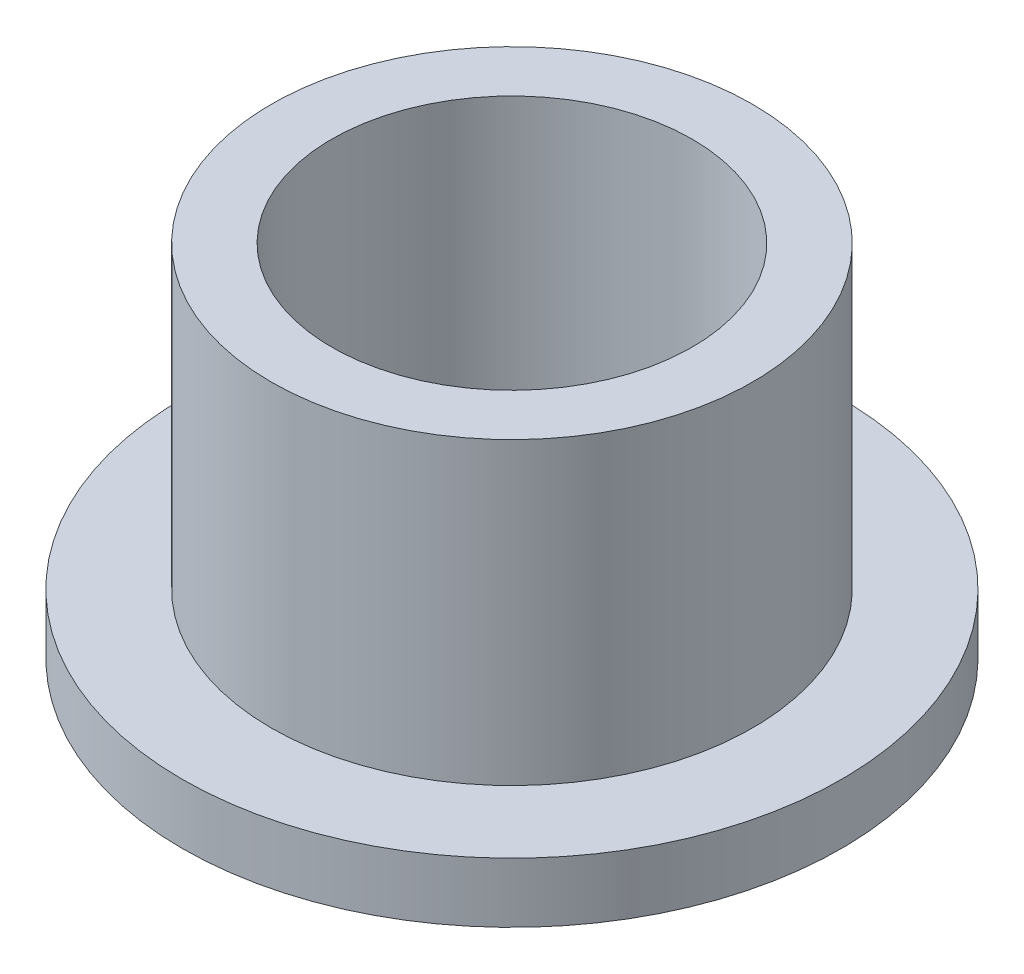
ISO-10303-21;
HEADER;
FILE_DESCRIPTION(('STEP AP214'),'2;1');
FILE_NAME('part.step','',(''),(''),'','','');
FILE_SCHEMA(('AUTOMOTIVE_DESIGN { 1 0 10303 214 1 1 1 1 }'));
ENDSEC;
DATA;
#1=APPLICATION_CONTEXT('core data for automotive mechanical design processes');
#2=APPLICATION_PROTOCOL_DEFINITION('international standard','automotive_design',2000,#1);
#3=PRODUCT_CONTEXT('',#1,'mechanical');
#4=PRODUCT('Part','Part','',(#3));
#5=PRODUCT_RELATED_PRODUCT_CATEGORY('part','',(#4));
#6=PRODUCT_DEFINITION_FORMATION('','',#4);
#7=PRODUCT_DEFINITION_CONTEXT('part definition',#1,'design');
#8=PRODUCT_DEFINITION('design','',#6,#7);
#9=PRODUCT_DEFINITION_SHAPE('','',#8);
#10=(LENGTH_UNIT() NAMED_UNIT(*) SI_UNIT(.MILLI.,.METRE.));
#11=(NAMED_UNIT(*) PLANE_ANGLE_UNIT() SI_UNIT($,.RADIAN.));
#12=(NAMED_UNIT(*) SI_UNIT($,.STERADIAN.) SOLID_ANGLE_UNIT());
#13=UNCERTAINTY_MEASURE_WITH_UNIT(LENGTH_MEASURE(1.E-05),#10,'distance_accuracy_value','');
#14=(GEOMETRIC_REPRESENTATION_CONTEXT(3) GLOBAL_UNCERTAINTY_ASSIGNED_CONTEXT((#13)) GLOBAL_UNIT_ASSIGNED_CONTEXT((#10,
#11,#12)) REPRESENTATION_CONTEXT('',''));
#15=CARTESIAN_POINT('',(0.,0.,0.));
#16=DIRECTION('',(0.,0.,1.));
#17=DIRECTION('',(1.,0.,0.));
#18=AXIS2_PLACEMENT_3D('',#15,#16,#17);
#19=CARTESIAN_POINT('',(0.,9.525,0.));
#20=DIRECTION('',(0.,1.,0.));
#21=DIRECTION('',(0.,0.,1.));
#22=AXIS2_PLACEMENT_3D('',#19,#20,#21);
#23=PLANE('',#22);
#24=CARTESIAN_POINT('',(0.,9.525,0.));
#25=DIRECTION('',(0.,1.,0.));
#26=DIRECTION('',(0.,0.,1.));
#27=AXIS2_PLACEMENT_3D('',#24,#25,#26);
#28=CIRCLE('',#27,6.3754);
#29=CARTESIAN_POINT('',(0.,9.525,-6.3754));
#30=VERTEX_POINT('',#29);
#31=EDGE_CURVE('E12',#30,#30,#28,.T.);
#32=ORIENTED_EDGE('',*,*,#31,.T.);
#33=EDGE_LOOP('',(#32));
#34=FACE_BOUND('',#33,.T.);
#35=CARTESIAN_POINT('',(0.,9.525,0.));
#36=DIRECTION('',(0.,1.,0.));
#37=DIRECTION('',(0.,0.,1.));
#38=AXIS2_PLACEMENT_3D('',#35,#36,#37);
#39=CIRCLE('',#38,4.7752);
#40=CARTESIAN_POINT('',(0.,9.525,-4.7752));
#41=VERTEX_POINT('',#40);
#42=EDGE_CURVE('E57',#41,#41,#39,.T.);
#43=ORIENTED_EDGE('',*,*,#42,.F.);
#44=EDGE_LOOP('',(#43));
#45=FACE_BOUND('',#44,.T.);
#46=ADVANCED_FACE('F49',(#34,#45),#23,.T.);
#47=CARTESIAN_POINT('',(0.,0.,0.));
#48=DIRECTION('',(0.,1.,0.));
#49=DIRECTION('',(0.,0.,1.));
#50=AXIS2_PLACEMENT_3D('',#47,#48,#49);
#51=PLANE('',#50);
#52=CARTESIAN_POINT('',(0.,0.,0.));
#53=DIRECTION('',(0.,1.,0.));
#54=DIRECTION('',(0.,0.,1.));
#55=AXIS2_PLACEMENT_3D('',#52,#53,#54);
#56=CIRCLE('',#55,4.7752);
#57=CARTESIAN_POINT('',(0.,0.,-4.7752));
#58=VERTEX_POINT('',#57);
#59=EDGE_CURVE('E63',#58,#58,#56,.T.);
#60=ORIENTED_EDGE('',*,*,#59,.T.);
#61=EDGE_LOOP('',(#60));
#62=FACE_BOUND('',#61,.T.);
#63=CARTESIAN_POINT('',(0.,0.,0.));
#64=DIRECTION('',(0.,1.,0.));
#65=DIRECTION('',(0.,0.,1.));
#66=AXIS2_PLACEMENT_3D('',#63,#64,#65);
#67=CIRCLE('',#66,8.73125);
#68=CARTESIAN_POINT('',(0.,0.,8.73125));
#69=VERTEX_POINT('',#68);
#70=EDGE_CURVE('E72',#69,#69,#67,.T.);
#71=ORIENTED_EDGE('',*,*,#70,.F.);
#72=EDGE_LOOP('',(#71));
#73=FACE_BOUND('',#72,.T.);
#74=ADVANCED_FACE('F101',(#62,#73),#51,.F.);
#75=CARTESIAN_POINT('',(0.,9.525,0.));
#76=DIRECTION('',(0.,-1.,0.));
#77=DIRECTION('',(0.,0.,-1.));
#78=AXIS2_PLACEMENT_3D('',#75,#76,#77);
#79=CYLINDRICAL_SURFACE('',#78,6.3754);
#80=CARTESIAN_POINT('',(0.,1.5875,0.));
#81=DIRECTION('',(0.,1.,0.));
#82=DIRECTION('',(0.,0.,1.));
#83=AXIS2_PLACEMENT_3D('',#80,#81,#82);
#84=CIRCLE('',#83,6.3754);
#85=CARTESIAN_POINT('',(0.,1.5875,-6.3754));
#86=VERTEX_POINT('',#85);
#87=EDGE_CURVE('E76',#86,#86,#84,.T.);
#88=CARTESIAN_POINT('',(0.,1.5875,-6.3754));
#89=CARTESIAN_POINT('',(0.,1.67018229166667,-6.3754));
#90=CARTESIAN_POINT('',(0.,1.75286458333333,-6.3754));
#91=CARTESIAN_POINT('',(0.,1.91822916666666,-6.3754));
#92=CARTESIAN_POINT('',(0.,2.00091145833333,-6.3754));
#93=CARTESIAN_POINT('',(0.,2.16627604166666,-6.3754));
#94=CARTESIAN_POINT('',(0.,2.24895833333333,-6.3754));
#95=CARTESIAN_POINT('',(0.,2.41432291666667,-6.3754));
#96=CARTESIAN_POINT('',(0.,2.49700520833333,-6.3754));
#97=CARTESIAN_POINT('',(0.,2.66236979166666,-6.3754));
#98=CARTESIAN_POINT('',(0.,2.74505208333333,-6.3754));
#99=CARTESIAN_POINT('',(0.,2.91041666666667,-6.3754));
#100=CARTESIAN_POINT('',(0.,2.99309895833333,-6.3754));
#101=CARTESIAN_POINT('',(0.,3.15846354166667,-6.3754));
#102=CARTESIAN_POINT('',(0.,3.24114583333333,-6.3754));
#103=CARTESIAN_POINT('',(0.,3.40651041666667,-6.3754));
#104=CARTESIAN_POINT('',(0.,3.48919270833333,-6.3754));
#105=CARTESIAN_POINT('',(0.,3.65455729166667,-6.3754));
#106=CARTESIAN_POINT('',(0.,3.73723958333333,-6.3754));
#107=CARTESIAN_POINT('',(0.,3.90260416666667,-6.3754));
#108=CARTESIAN_POINT('',(0.,3.98528645833333,-6.3754));
#109=CARTESIAN_POINT('',(0.,4.15065104166667,-6.3754));
#110=CARTESIAN_POINT('',(0.,4.23333333333333,-6.3754));
#111=CARTESIAN_POINT('',(0.,4.39869791666667,-6.3754));
#112=CARTESIAN_POINT('',(0.,4.48138020833333,-6.3754));
#113=CARTESIAN_POINT('',(0.,4.64674479166667,-6.3754));
#114=CARTESIAN_POINT('',(0.,4.72942708333333,-6.3754));
#115=CARTESIAN_POINT('',(0.,4.89479166666667,-6.3754));
#116=CARTESIAN_POINT('',(0.,4.97747395833333,-6.3754));
#117=CARTESIAN_POINT('',(0.,5.14283854166667,-6.3754));
#118=CARTESIAN_POINT('',(0.,5.22552083333333,-6.3754));
#119=CARTESIAN_POINT('',(0.,5.39088541666667,-6.3754));
#120=CARTESIAN_POINT('',(0.,5.47356770833333,-6.3754));
#121=CARTESIAN_POINT('',(0.,5.63893229166667,-6.3754));
#122=CARTESIAN_POINT('',(0.,5.72161458333333,-6.3754));
#123=CARTESIAN_POINT('',(0.,5.88697916666667,-6.3754));
#124=CARTESIAN_POINT('',(0.,5.96966145833333,-6.3754));
#125=CARTESIAN_POINT('',(0.,6.13502604166667,-6.3754));
#126=CARTESIAN_POINT('',(0.,6.21770833333333,-6.3754));
#127=CARTESIAN_POINT('',(0.,6.38307291666667,-6.3754));
#128=CARTESIAN_POINT('',(0.,6.46575520833333,-6.3754));
#129=CARTESIAN_POINT('',(0.,6.63111979166667,-6.3754));
#130=CARTESIAN_POINT('',(0.,6.71380208333333,-6.3754));
#131=CARTESIAN_POINT('',(0.,6.87916666666667,-6.3754));
#132=CARTESIAN_POINT('',(0.,6.96184895833333,-6.3754));
#133=CARTESIAN_POINT('',(0.,7.12721354166667,-6.3754));
#134=CARTESIAN_POINT('',(0.,7.20989583333333,-6.3754));
#135=CARTESIAN_POINT('',(0.,7.37526041666667,-6.3754));
#136=CARTESIAN_POINT('',(0.,7.45794270833333,-6.3754));
#137=CARTESIAN_POINT('',(0.,7.62330729166667,-6.3754));
#138=CARTESIAN_POINT('',(0.,7.70598958333333,-6.3754));
#139=CARTESIAN_POINT('',(0.,7.87135416666667,-6.3754));
#140=CARTESIAN_POINT('',(0.,7.95403645833333,-6.3754));
#141=CARTESIAN_POINT('',(0.,8.11940104166667,-6.3754));
#142=CARTESIAN_POINT('',(0.,8.20208333333333,-6.3754));
#143=CARTESIAN_POINT('',(0.,8.36744791666667,-6.3754));
#144=CARTESIAN_POINT('',(0.,8.45013020833333,-6.3754));
#145=CARTESIAN_POINT('',(0.,8.61549479166667,-6.3754));
#146=CARTESIAN_POINT('',(0.,8.69817708333333,-6.3754));
#147=CARTESIAN_POINT('',(0.,8.86354166666667,-6.3754));
#148=CARTESIAN_POINT('',(0.,8.94622395833333,-6.3754));
#149=CARTESIAN_POINT('',(0.,9.11158854166667,-6.3754));
#150=CARTESIAN_POINT('',(0.,9.19427083333333,-6.3754));
#151=CARTESIAN_POINT('',(0.,9.35963541666667,-6.3754));
#152=CARTESIAN_POINT('',(0.,9.44231770833333,-6.3754));
#153=CARTESIAN_POINT('',(0.,9.525,-6.3754));
#154=B_SPLINE_CURVE_WITH_KNOTS('',3,(#88,#89,#90,#91,#92,#93,#94,#95,#96,#97,#98,#99,#100,#101,
#102,#103,#104,#105,#106,#107,#108,#109,#110,#111,#112,#113,#114,#115,#116,#117,#118,#119,#120,
#121,#122,#123,#124,#125,#126,#127,#128,#129,#130,#131,#132,#133,#134,#135,#136,#137,#138,#139,
#140,#141,#142,#143,#144,#145,#146,#147,#148,#149,#150,#151,#152,#153),.UNSPECIFIED.,.F.,.F.,(4,
2,2,2,2,2,2,2,2,2,2,2,2,2,2,2,2,2,2,2,2,2,2,2,2,2,2,2,2,2,2,2,4),(0.,0.248046875,
0.496093749999999,0.744140625,0.992187499999999,1.240234375,1.48828125,1.736328125,1.984375,
2.232421875,2.48046875,2.728515625,2.9765625,3.224609375,3.47265625,3.720703125,3.96875,
4.216796875,4.46484375,4.712890625,4.9609375,5.208984375,5.45703125,5.705078125,5.953125,
6.201171875,6.44921875,6.697265625,6.9453125,7.193359375,7.44140625,7.689453125,7.9375),.UNSPECIFIED.);
#155=EDGE_CURVE('BSEAM51',#86,#30,#154,.T.);
#156=ORIENTED_EDGE('',*,*,#87,.T.);
#157=ORIENTED_EDGE('',*,*,#31,.F.);
#158=ORIENTED_EDGE('',*,*,#155,.T.);
#159=ORIENTED_EDGE('',*,*,#155,.F.);
#160=EDGE_LOOP('',(#156,#158,#157,#159));
#161=FACE_BOUND('',#160,.T.);
#162=ADVANCED_FACE('F51',(#161),#79,.T.);
#163=CARTESIAN_POINT('',(0.,9.525,0.));
#164=DIRECTION('',(0.,-1.,0.));
#165=DIRECTION('',(0.,0.,-1.));
#166=AXIS2_PLACEMENT_3D('',#163,#164,#165);
#167=CYLINDRICAL_SURFACE('',#166,4.7752);
#168=CARTESIAN_POINT('',(0.,9.525,-4.7752));
#169=CARTESIAN_POINT('',(0.,9.42578125,-4.7752));
#170=CARTESIAN_POINT('',(0.,9.3265625,-4.7752));
#171=CARTESIAN_POINT('',(0.,9.128125,-4.7752));
#172=CARTESIAN_POINT('',(0.,9.02890625,-4.7752));
#173=CARTESIAN_POINT('',(0.,8.83046875,-4.7752));
#174=CARTESIAN_POINT('',(0.,8.73125,-4.7752));
#175=CARTESIAN_POINT('',(0.,8.5328125,-4.7752));
#176=CARTESIAN_POINT('',(0.,8.43359375,-4.7752));
#177=CARTESIAN_POINT('',(0.,8.23515625,-4.7752));
#178=CARTESIAN_POINT('',(0.,8.1359375,-4.7752));
#179=CARTESIAN_POINT('',(0.,7.9375,-4.7752));
#180=CARTESIAN_POINT('',(0.,7.83828125,-4.7752));
#181=CARTESIAN_POINT('',(0.,7.63984375,-4.7752));
#182=CARTESIAN_POINT('',(0.,7.540625,-4.7752));
#183=CARTESIAN_POINT('',(0.,7.3421875,-4.7752));
#184=CARTESIAN_POINT('',(0.,7.24296875,-4.7752));
#185=CARTESIAN_POINT('',(0.,7.04453125,-4.7752));
#186=CARTESIAN_POINT('',(0.,6.9453125,-4.7752));
#187=CARTESIAN_POINT('',(0.,6.746875,-4.7752));
#188=CARTESIAN_POINT('',(0.,6.64765625,-4.7752));
#189=CARTESIAN_POINT('',(0.,6.44921875,-4.7752));
#190=CARTESIAN_POINT('',(0.,6.35,-4.7752));
#191=CARTESIAN_POINT('',(0.,6.1515625,-4.7752));
#192=CARTESIAN_POINT('',(0.,6.05234375,-4.7752));
#193=CARTESIAN_POINT('',(0.,5.85390625,-4.7752));
#194=CARTESIAN_POINT('',(0.,5.7546875,-4.7752));
#195=CARTESIAN_POINT('',(0.,5.55625,-4.7752));
#196=CARTESIAN_POINT('',(0.,5.45703125,-4.7752));
#197=CARTESIAN_POINT('',(0.,5.25859375,-4.7752));
#198=CARTESIAN_POINT('',(0.,5.159375,-4.7752));
#199=CARTESIAN_POINT('',(0.,4.9609375,-4.7752));
#200=CARTESIAN_POINT('',(0.,4.86171875,-4.7752));
#201=CARTESIAN_POINT('',(0.,4.66328125,-4.7752));
#202=CARTESIAN_POINT('',(0.,4.5640625,-4.7752));
#203=CARTESIAN_POINT('',(0.,4.365625,-4.7752));
#204=CARTESIAN_POINT('',(0.,4.26640625,-4.7752));
#205=CARTESIAN_POINT('',(0.,4.06796875,-4.7752));
#206=CARTESIAN_POINT('',(0.,3.96875,-4.7752));
#207=CARTESIAN_POINT('',(0.,3.7703125,-4.7752));
#208=CARTESIAN_POINT('',(0.,3.67109375,-4.7752));
#209=CARTESIAN_POINT('',(0.,3.47265625,-4.7752));
#210=CARTESIAN_POINT('',(0.,3.3734375,-4.7752));
#211=CARTESIAN_POINT('',(0.,3.175,-4.7752));
#212=CARTESIAN_POINT('',(0.,3.07578125,-4.7752));
#213=CARTESIAN_POINT('',(0.,2.87734375,-4.7752));
#214=CARTESIAN_POINT('',(0.,2.778125,-4.7752));
#215=CARTESIAN_POINT('',(0.,2.5796875,-4.7752));
#216=CARTESIAN_POINT('',(0.,2.48046875,-4.7752));
#217=CARTESIAN_POINT('',(0.,2.28203125,-4.7752));
#218=CARTESIAN_POINT('',(0.,2.1828125,-4.7752));
#219=CARTESIAN_POINT('',(0.,1.984375,-4.7752));
#220=CARTESIAN_POINT('',(0.,1.88515625,-4.7752));
#221=CARTESIAN_POINT('',(0.,1.68671875,-4.7752));
#222=CARTESIAN_POINT('',(0.,1.5875,-4.7752));
#223=CARTESIAN_POINT('',(0.,1.3890625,-4.7752));
#224=CARTESIAN_POINT('',(0.,1.28984375,-4.7752));
#225=CARTESIAN_POINT('',(0.,1.09140625,-4.7752));
#226=CARTESIAN_POINT('',(0.,0.992187500000001,-4.7752));
#227=CARTESIAN_POINT('',(0.,0.793750000000001,-4.7752));
#228=CARTESIAN_POINT('',(0.,0.69453125,-4.7752));
#229=CARTESIAN_POINT('',(0.,0.49609375,-4.7752));
#230=CARTESIAN_POINT('',(0.,0.396875,-4.7752));
#231=CARTESIAN_POINT('',(0.,0.1984375,-4.7752));
#232=CARTESIAN_POINT('',(0.,0.0992187500000001,-4.7752));
#233=CARTESIAN_POINT('',(0.,0.,-4.7752));
#234=B_SPLINE_CURVE_WITH_KNOTS('',3,(#168,#169,#170,#171,#172,#173,#174,#175,#176,#177,#178,
#179,#180,#181,#182,#183,#184,#185,#186,#187,#188,#189,#190,#191,#192,#193,#194,#195,#196,#197,
#198,#199,#200,#201,#202,#203,#204,#205,#206,#207,#208,#209,#210,#211,#212,#213,#214,#215,#216,
#217,#218,#219,#220,#221,#222,#223,#224,#225,#226,#227,#228,#229,#230,#231,#232,#233),
.UNSPECIFIED.,.F.,.F.,(4,2,2,2,2,2,2,2,2,2,2,2,2,2,2,2,2,2,2,2,2,2,2,2,2,2,2,2,2,2,2,2,4),(0.,
0.297656249999998,0.595312499999999,0.892968749999999,1.190625,1.48828125,1.7859375,2.08359375,
2.38125,2.67890625,2.9765625,3.27421875,3.571875,3.86953125,4.1671875,4.46484375,4.7625,
5.06015625,5.3578125,5.65546875,5.953125,6.25078125,6.5484375,6.84609375,7.14375,7.44140625,
7.7390625,8.03671875,8.334375,8.63203125,8.9296875,9.22734375,9.525),.UNSPECIFIED.);
#235=EDGE_CURVE('BSEAM90',#41,#58,#234,.T.);
#236=ORIENTED_EDGE('',*,*,#42,.T.);
#237=ORIENTED_EDGE('',*,*,#59,.F.);
#238=ORIENTED_EDGE('',*,*,#235,.T.);
#239=ORIENTED_EDGE('',*,*,#235,.F.);
#240=EDGE_LOOP('',(#236,#238,#237,#239));
#241=FACE_BOUND('',#240,.T.);
#242=ADVANCED_FACE('F90',(#241),#167,.F.);
#243=CARTESIAN_POINT('',(0.,1.5875,0.));
#244=DIRECTION('',(0.,1.,0.));
#245=DIRECTION('',(0.,0.,1.));
#246=AXIS2_PLACEMENT_3D('',#243,#244,#245);
#247=PLANE('',#246);
#248=CARTESIAN_POINT('',(0.,1.5875,0.));
#249=DIRECTION('',(0.,1.,0.));
#250=DIRECTION('',(0.,0.,1.));
#251=AXIS2_PLACEMENT_3D('',#248,#249,#250);
#252=CIRCLE('',#251,8.73125);
#253=CARTESIAN_POINT('',(0.,1.5875,8.73125));
#254=VERTEX_POINT('',#253);
#255=EDGE_CURVE('E70',#254,#254,#252,.T.);
#256=ORIENTED_EDGE('',*,*,#255,.T.);
#257=EDGE_LOOP('',(#256));
#258=FACE_BOUND('',#257,.T.);
#259=ORIENTED_EDGE('',*,*,#87,.F.);
#260=EDGE_LOOP('',(#259));
#261=FACE_BOUND('',#260,.T.);
#262=ADVANCED_FACE('F87',(#258,#261),#247,.T.);
#263=CARTESIAN_POINT('',(0.,1.5875,0.));
#264=DIRECTION('',(0.,-1.,0.));
#265=DIRECTION('',(0.,0.,-1.));
#266=AXIS2_PLACEMENT_3D('',#263,#264,#265);
#267=CYLINDRICAL_SURFACE('',#266,8.73125);
#268=ORIENTED_EDGE('',*,*,#255,.F.);
#269=EDGE_LOOP('',(#268));
#270=FACE_BOUND('',#269,.T.);
#271=ORIENTED_EDGE('',*,*,#70,.T.);
#272=EDGE_LOOP('',(#271));
#273=FACE_BOUND('',#272,.T.);
#274=ADVANCED_FACE('F89',(#270,#273),#267,.T.);
#275=CLOSED_SHELL('',(#46,#74,#162,#242,#262,#274));
#276=MANIFOLD_SOLID_BREP('B2',#275);
#277=ADVANCED_BREP_SHAPE_REPRESENTATION('',(#18,#276),#14);
#278=SHAPE_DEFINITION_REPRESENTATION(#9,#277);
ENDSEC;
END-ISO-10303-21;
